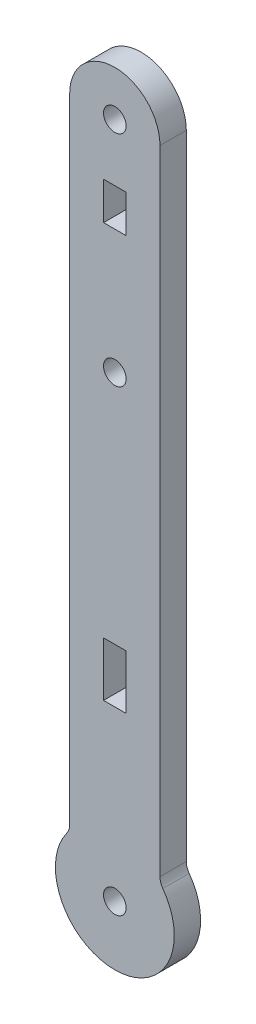
ISO-10303-21;
HEADER;
FILE_DESCRIPTION(('STEP AP214'),'2;1');
FILE_NAME('part.step','',(''),(''),'','','');
FILE_SCHEMA(('AUTOMOTIVE_DESIGN { 1 0 10303 214 1 1 1 1 }'));
ENDSEC;
DATA;
#1=APPLICATION_CONTEXT('core data for automotive mechanical design processes');
#2=APPLICATION_PROTOCOL_DEFINITION('international standard','automotive_design',2000,#1);
#3=PRODUCT_CONTEXT('',#1,'mechanical');
#4=PRODUCT('Part','Part','',(#3));
#5=PRODUCT_RELATED_PRODUCT_CATEGORY('part','',(#4));
#6=PRODUCT_DEFINITION_FORMATION('','',#4);
#7=PRODUCT_DEFINITION_CONTEXT('part definition',#1,'design');
#8=PRODUCT_DEFINITION('design','',#6,#7);
#9=PRODUCT_DEFINITION_SHAPE('','',#8);
#10=(LENGTH_UNIT() NAMED_UNIT(*) SI_UNIT(.MILLI.,.METRE.));
#11=(NAMED_UNIT(*) PLANE_ANGLE_UNIT() SI_UNIT($,.RADIAN.));
#12=(NAMED_UNIT(*) SI_UNIT($,.STERADIAN.) SOLID_ANGLE_UNIT());
#13=UNCERTAINTY_MEASURE_WITH_UNIT(LENGTH_MEASURE(1.E-05),#10,'distance_accuracy_value','');
#14=(GEOMETRIC_REPRESENTATION_CONTEXT(3) GLOBAL_UNCERTAINTY_ASSIGNED_CONTEXT((#13)) GLOBAL_UNIT_ASSIGNED_CONTEXT((#10,
#11,#12)) REPRESENTATION_CONTEXT('',''));
#15=CARTESIAN_POINT('',(0.,0.,0.));
#16=DIRECTION('',(0.,0.,1.));
#17=DIRECTION('',(1.,0.,0.));
#18=AXIS2_PLACEMENT_3D('',#15,#16,#17);
#19=CARTESIAN_POINT('',(0.,90.,3.5));
#20=DIRECTION('',(0.,0.,-1.));
#21=DIRECTION('',(-1.,0.,0.));
#22=AXIS2_PLACEMENT_3D('',#19,#20,#21);
#23=PLANE('',#22);
#24=CARTESIAN_POINT('',(0.,90.,3.5));
#25=DIRECTION('',(0.,0.,1.));
#26=DIRECTION('',(1.,0.,0.));
#27=AXIS2_PLACEMENT_3D('',#24,#25,#26);
#28=CIRCLE('',#27,1.5);
#29=CARTESIAN_POINT('',(1.5,90.,3.5));
#30=VERTEX_POINT('',#29);
#31=EDGE_CURVE('E184',#30,#30,#28,.T.);
#32=ORIENTED_EDGE('',*,*,#31,.F.);
#33=EDGE_LOOP('',(#32));
#34=FACE_BOUND('',#33,.T.);
#35=DIRECTION('',(1.,0.,0.));
#36=VECTOR('',#35,1.);
#37=CARTESIAN_POINT('',(-1.50000000000456,22.3769852360445,3.5));
#38=LINE('',#37,#36);
#39=CARTESIAN_POINT('',(-1.50000000000456,22.3769852360445,3.5));
#40=VERTEX_POINT('',#39);
#41=CARTESIAN_POINT('',(1.49999999999544,22.3769852360445,3.5));
#42=VERTEX_POINT('',#41);
#43=EDGE_CURVE('E190',#40,#42,#38,.T.);
#44=ORIENTED_EDGE('',*,*,#43,.F.);
#45=DIRECTION('',(0.,-1.,0.));
#46=VECTOR('',#45,1.);
#47=CARTESIAN_POINT('',(-1.50000000000456,29.5769852360445,3.5));
#48=LINE('',#47,#46);
#49=CARTESIAN_POINT('',(-1.50000000000456,29.5769852360445,3.5));
#50=VERTEX_POINT('',#49);
#51=EDGE_CURVE('E198',#50,#40,#48,.T.);
#52=ORIENTED_EDGE('',*,*,#51,.F.);
#53=DIRECTION('',(-1.,0.,0.));
#54=VECTOR('',#53,1.);
#55=CARTESIAN_POINT('',(1.49999999999544,29.5769852360445,3.5));
#56=LINE('',#55,#54);
#57=CARTESIAN_POINT('',(1.49999999999544,29.5769852360445,3.5));
#58=VERTEX_POINT('',#57);
#59=EDGE_CURVE('E195',#58,#50,#56,.T.);
#60=ORIENTED_EDGE('',*,*,#59,.F.);
#61=DIRECTION('',(0.,1.,0.));
#62=VECTOR('',#61,1.);
#63=CARTESIAN_POINT('',(1.49999999999544,22.3769852360445,3.5));
#64=LINE('',#63,#62);
#65=EDGE_CURVE('E192',#42,#58,#64,.T.);
#66=ORIENTED_EDGE('',*,*,#65,.F.);
#67=EDGE_LOOP('',(#44,#52,#60,#66));
#68=FACE_BOUND('',#67,.T.);
#69=CARTESIAN_POINT('',(0.,90.,3.5));
#70=DIRECTION('',(0.,0.,1.));
#71=DIRECTION('',(-1.,0.,0.));
#72=AXIS2_PLACEMENT_3D('',#69,#70,#71);
#73=CIRCLE('',#72,6.);
#74=CARTESIAN_POINT('',(6.,90.,3.5));
#75=VERTEX_POINT('',#74);
#76=CARTESIAN_POINT('',(-6.,90.,3.5));
#77=VERTEX_POINT('',#76);
#78=EDGE_CURVE('E228',#75,#77,#73,.T.);
#79=ORIENTED_EDGE('',*,*,#78,.T.);
#80=DIRECTION('',(0.,-1.,0.));
#81=VECTOR('',#80,1.);
#82=CARTESIAN_POINT('',(-6.,90.,3.5));
#83=LINE('',#82,#81);
#84=CARTESIAN_POINT('',(-5.99999999999999,5.83180932472935,3.5));
#85=VERTEX_POINT('',#84);
#86=EDGE_CURVE('E231',#77,#85,#83,.T.);
#87=ORIENTED_EDGE('',*,*,#86,.T.);
#88=CARTESIAN_POINT('',(-7.99999999999999,5.83180932472935,3.5));
#89=DIRECTION('',(0.,0.,-1.));
#90=DIRECTION('',(-1.,0.,0.));
#91=AXIS2_PLACEMENT_3D('',#88,#89,#90);
#92=CIRCLE('',#91,2.);
#93=CARTESIAN_POINT('',(-6.38383838383837,4.65366602680423,3.5));
#94=VERTEX_POINT('',#93);
#95=EDGE_CURVE('E265',#85,#94,#92,.T.);
#96=ORIENTED_EDGE('',*,*,#95,.T.);
#97=CARTESIAN_POINT('',(0.,0.,3.5));
#98=DIRECTION('',(0.,0.,1.));
#99=DIRECTION('',(1.,0.,0.));
#100=AXIS2_PLACEMENT_3D('',#97,#98,#99);
#101=CIRCLE('',#100,7.9);
#102=CARTESIAN_POINT('',(6.38383838383838,4.65366602680422,3.5));
#103=VERTEX_POINT('',#102);
#104=EDGE_CURVE('E235',#94,#103,#101,.T.);
#105=ORIENTED_EDGE('',*,*,#104,.T.);
#106=CARTESIAN_POINT('',(8.,5.83180932472933,3.5));
#107=DIRECTION('',(0.,0.,-1.));
#108=DIRECTION('',(-1.,0.,0.));
#109=AXIS2_PLACEMENT_3D('',#106,#107,#108);
#110=CIRCLE('',#109,2.);
#111=CARTESIAN_POINT('',(6.,5.83180932472933,3.5));
#112=VERTEX_POINT('',#111);
#113=EDGE_CURVE('E12',#103,#112,#110,.T.);
#114=ORIENTED_EDGE('',*,*,#113,.T.);
#115=DIRECTION('',(0.,1.,0.));
#116=VECTOR('',#115,1.);
#117=CARTESIAN_POINT('',(6.,90.,3.5));
#118=LINE('',#117,#116);
#119=EDGE_CURVE('E237',#112,#75,#118,.T.);
#120=ORIENTED_EDGE('',*,*,#119,.T.);
#121=EDGE_LOOP('',(#79,#87,#96,#105,#114,#120));
#122=FACE_BOUND('',#121,.T.);
#123=CARTESIAN_POINT('',(0.,0.,3.5));
#124=DIRECTION('',(0.,0.,1.));
#125=DIRECTION('',(1.,0.,0.));
#126=AXIS2_PLACEMENT_3D('',#123,#124,#125);
#127=CIRCLE('',#126,1.5);
#128=CARTESIAN_POINT('',(1.5,0.,3.5));
#129=VERTEX_POINT('',#128);
#130=EDGE_CURVE('E221',#129,#129,#127,.T.);
#131=ORIENTED_EDGE('',*,*,#130,.F.);
#132=EDGE_LOOP('',(#131));
#133=FACE_BOUND('',#132,.T.);
#134=DIRECTION('',(1.,0.,0.));
#135=VECTOR('',#134,1.);
#136=CARTESIAN_POINT('',(-1.50000000000457,77.3769852360445,3.5));
#137=LINE('',#136,#135);
#138=CARTESIAN_POINT('',(-1.50000000000457,77.3769852360445,3.5));
#139=VERTEX_POINT('',#138);
#140=CARTESIAN_POINT('',(1.49999999999543,77.3769852360445,3.5));
#141=VERTEX_POINT('',#140);
#142=EDGE_CURVE('E140',#139,#141,#137,.T.);
#143=ORIENTED_EDGE('',*,*,#142,.F.);
#144=DIRECTION('',(0.,-1.,0.));
#145=VECTOR('',#144,1.);
#146=CARTESIAN_POINT('',(-1.50000000000457,82.3769852360445,3.5));
#147=LINE('',#146,#145);
#148=CARTESIAN_POINT('',(-1.50000000000457,82.3769852360445,3.5));
#149=VERTEX_POINT('',#148);
#150=EDGE_CURVE('E166',#149,#139,#147,.T.);
#151=ORIENTED_EDGE('',*,*,#150,.F.);
#152=DIRECTION('',(-1.,0.,0.));
#153=VECTOR('',#152,1.);
#154=CARTESIAN_POINT('',(1.49999999999543,82.3769852360445,3.5));
#155=LINE('',#154,#153);
#156=CARTESIAN_POINT('',(1.49999999999543,82.3769852360445,3.5));
#157=VERTEX_POINT('',#156);
#158=EDGE_CURVE('E164',#157,#149,#155,.T.);
#159=ORIENTED_EDGE('',*,*,#158,.F.);
#160=DIRECTION('',(0.,1.,0.));
#161=VECTOR('',#160,1.);
#162=CARTESIAN_POINT('',(1.49999999999543,77.3769852360445,3.5));
#163=LINE('',#162,#161);
#164=EDGE_CURVE('E150',#141,#157,#163,.T.);
#165=ORIENTED_EDGE('',*,*,#164,.F.);
#166=EDGE_LOOP('',(#143,#151,#159,#165));
#167=FACE_BOUND('',#166,.T.);
#168=CARTESIAN_POINT('',(-4.56665955050894E-12,60.8769852360445,3.5));
#169=DIRECTION('',(0.,0.,1.));
#170=DIRECTION('',(1.,0.,0.));
#171=AXIS2_PLACEMENT_3D('',#168,#169,#170);
#172=CIRCLE('',#171,1.5);
#173=CARTESIAN_POINT('',(1.49999999999543,60.8769852360445,3.5));
#174=VERTEX_POINT('',#173);
#175=EDGE_CURVE('E173',#174,#174,#172,.T.);
#176=ORIENTED_EDGE('',*,*,#175,.F.);
#177=EDGE_LOOP('',(#176));
#178=FACE_BOUND('',#177,.T.);
#179=ADVANCED_FACE('F39',(#34,#68,#122,#133,#167,#178),#23,.F.);
#180=CARTESIAN_POINT('',(0.,90.,0.));
#181=DIRECTION('',(0.,0.,-1.));
#182=DIRECTION('',(-1.,0.,0.));
#183=AXIS2_PLACEMENT_3D('',#180,#181,#182);
#184=PLANE('',#183);
#185=DIRECTION('',(0.,-1.,0.));
#186=VECTOR('',#185,1.);
#187=CARTESIAN_POINT('',(-1.50000000000457,82.3769852360445,0.));
#188=LINE('',#187,#186);
#189=CARTESIAN_POINT('',(-1.50000000000457,82.3769852360445,0.));
#190=VERTEX_POINT('',#189);
#191=CARTESIAN_POINT('',(-1.50000000000457,77.3769852360445,0.));
#192=VERTEX_POINT('',#191);
#193=EDGE_CURVE('E151',#190,#192,#188,.T.);
#194=ORIENTED_EDGE('',*,*,#193,.T.);
#195=DIRECTION('',(1.,0.,0.));
#196=VECTOR('',#195,1.);
#197=CARTESIAN_POINT('',(-1.50000000000457,77.3769852360445,0.));
#198=LINE('',#197,#196);
#199=CARTESIAN_POINT('',(1.49999999999543,77.3769852360445,0.));
#200=VERTEX_POINT('',#199);
#201=EDGE_CURVE('E171',#192,#200,#198,.T.);
#202=ORIENTED_EDGE('',*,*,#201,.T.);
#203=DIRECTION('',(0.,1.,0.));
#204=VECTOR('',#203,1.);
#205=CARTESIAN_POINT('',(1.49999999999543,77.3769852360445,0.));
#206=LINE('',#205,#204);
#207=CARTESIAN_POINT('',(1.49999999999543,82.3769852360445,0.));
#208=VERTEX_POINT('',#207);
#209=EDGE_CURVE('E157',#200,#208,#206,.T.);
#210=ORIENTED_EDGE('',*,*,#209,.T.);
#211=DIRECTION('',(-1.,0.,0.));
#212=VECTOR('',#211,1.);
#213=CARTESIAN_POINT('',(1.49999999999543,82.3769852360445,0.));
#214=LINE('',#213,#212);
#215=EDGE_CURVE('E174',#208,#190,#214,.T.);
#216=ORIENTED_EDGE('',*,*,#215,.T.);
#217=EDGE_LOOP('',(#194,#202,#210,#216));
#218=FACE_BOUND('',#217,.T.);
#219=CARTESIAN_POINT('',(0.,90.,0.));
#220=DIRECTION('',(0.,0.,1.));
#221=DIRECTION('',(1.,0.,0.));
#222=AXIS2_PLACEMENT_3D('',#219,#220,#221);
#223=CIRCLE('',#222,1.5);
#224=CARTESIAN_POINT('',(1.5,90.,0.));
#225=VERTEX_POINT('',#224);
#226=EDGE_CURVE('E158',#225,#225,#223,.T.);
#227=ORIENTED_EDGE('',*,*,#226,.T.);
#228=EDGE_LOOP('',(#227));
#229=FACE_BOUND('',#228,.T.);
#230=CARTESIAN_POINT('',(0.,90.,0.));
#231=DIRECTION('',(0.,0.,1.));
#232=DIRECTION('',(-1.,0.,0.));
#233=AXIS2_PLACEMENT_3D('',#230,#231,#232);
#234=CIRCLE('',#233,6.);
#235=CARTESIAN_POINT('',(6.,90.,0.));
#236=VERTEX_POINT('',#235);
#237=CARTESIAN_POINT('',(-6.,90.,0.));
#238=VERTEX_POINT('',#237);
#239=EDGE_CURVE('E225',#236,#238,#234,.T.);
#240=ORIENTED_EDGE('',*,*,#239,.F.);
#241=DIRECTION('',(0.,1.,0.));
#242=VECTOR('',#241,1.);
#243=CARTESIAN_POINT('',(6.,90.,0.));
#244=LINE('',#243,#242);
#245=CARTESIAN_POINT('',(6.,5.83180932472933,0.));
#246=VERTEX_POINT('',#245);
#247=EDGE_CURVE('E232',#246,#236,#244,.T.);
#248=ORIENTED_EDGE('',*,*,#247,.F.);
#249=CARTESIAN_POINT('',(8.,5.83180932472933,0.));
#250=DIRECTION('',(0.,0.,-1.));
#251=DIRECTION('',(-1.,0.,0.));
#252=AXIS2_PLACEMENT_3D('',#249,#250,#251);
#253=CIRCLE('',#252,2.);
#254=CARTESIAN_POINT('',(6.38383838383838,4.65366602680422,0.));
#255=VERTEX_POINT('',#254);
#256=EDGE_CURVE('E47',#246,#255,#253,.F.);
#257=ORIENTED_EDGE('',*,*,#256,.T.);
#258=CARTESIAN_POINT('',(0.,0.,0.));
#259=DIRECTION('',(0.,0.,1.));
#260=DIRECTION('',(1.,0.,0.));
#261=AXIS2_PLACEMENT_3D('',#258,#259,#260);
#262=CIRCLE('',#261,7.9);
#263=CARTESIAN_POINT('',(-6.38383838383837,4.65366602680423,0.));
#264=VERTEX_POINT('',#263);
#265=EDGE_CURVE('E245',#264,#255,#262,.T.);
#266=ORIENTED_EDGE('',*,*,#265,.F.);
#267=CARTESIAN_POINT('',(-7.99999999999999,5.83180932472935,0.));
#268=DIRECTION('',(0.,0.,-1.));
#269=DIRECTION('',(-1.,0.,0.));
#270=AXIS2_PLACEMENT_3D('',#267,#268,#269);
#271=CIRCLE('',#270,2.);
#272=CARTESIAN_POINT('',(-5.99999999999999,5.83180932472935,0.));
#273=VERTEX_POINT('',#272);
#274=EDGE_CURVE('E263',#264,#273,#271,.F.);
#275=ORIENTED_EDGE('',*,*,#274,.T.);
#276=DIRECTION('',(0.,-1.,0.));
#277=VECTOR('',#276,1.);
#278=CARTESIAN_POINT('',(-6.,90.,0.));
#279=LINE('',#278,#277);
#280=EDGE_CURVE('E242',#238,#273,#279,.T.);
#281=ORIENTED_EDGE('',*,*,#280,.F.);
#282=EDGE_LOOP('',(#240,#248,#257,#266,#275,#281));
#283=FACE_BOUND('',#282,.T.);
#284=CARTESIAN_POINT('',(0.,0.,0.));
#285=DIRECTION('',(0.,0.,1.));
#286=DIRECTION('',(1.,0.,0.));
#287=AXIS2_PLACEMENT_3D('',#284,#285,#286);
#288=CIRCLE('',#287,1.5);
#289=CARTESIAN_POINT('',(1.5,0.,0.));
#290=VERTEX_POINT('',#289);
#291=EDGE_CURVE('E220',#290,#290,#288,.T.);
#292=ORIENTED_EDGE('',*,*,#291,.T.);
#293=EDGE_LOOP('',(#292));
#294=FACE_BOUND('',#293,.T.);
#295=DIRECTION('',(0.,-1.,0.));
#296=VECTOR('',#295,1.);
#297=CARTESIAN_POINT('',(-1.50000000000456,29.5769852360445,0.));
#298=LINE('',#297,#296);
#299=CARTESIAN_POINT('',(-1.50000000000456,29.5769852360445,0.));
#300=VERTEX_POINT('',#299);
#301=CARTESIAN_POINT('',(-1.50000000000456,22.3769852360445,0.));
#302=VERTEX_POINT('',#301);
#303=EDGE_CURVE('E193',#300,#302,#298,.T.);
#304=ORIENTED_EDGE('',*,*,#303,.T.);
#305=DIRECTION('',(1.,0.,0.));
#306=VECTOR('',#305,1.);
#307=CARTESIAN_POINT('',(-1.50000000000456,22.3769852360445,0.));
#308=LINE('',#307,#306);
#309=CARTESIAN_POINT('',(1.49999999999544,22.3769852360445,0.));
#310=VERTEX_POINT('',#309);
#311=EDGE_CURVE('E187',#302,#310,#308,.T.);
#312=ORIENTED_EDGE('',*,*,#311,.T.);
#313=DIRECTION('',(0.,1.,0.));
#314=VECTOR('',#313,1.);
#315=CARTESIAN_POINT('',(1.49999999999544,22.3769852360445,0.));
#316=LINE('',#315,#314);
#317=CARTESIAN_POINT('',(1.49999999999544,29.5769852360445,0.));
#318=VERTEX_POINT('',#317);
#319=EDGE_CURVE('E203',#310,#318,#316,.T.);
#320=ORIENTED_EDGE('',*,*,#319,.T.);
#321=DIRECTION('',(-1.,0.,0.));
#322=VECTOR('',#321,1.);
#323=CARTESIAN_POINT('',(1.49999999999544,29.5769852360445,0.));
#324=LINE('',#323,#322);
#325=EDGE_CURVE('E206',#318,#300,#324,.T.);
#326=ORIENTED_EDGE('',*,*,#325,.T.);
#327=EDGE_LOOP('',(#304,#312,#320,#326));
#328=FACE_BOUND('',#327,.T.);
#329=CARTESIAN_POINT('',(-4.56665955050894E-12,60.8769852360445,0.));
#330=DIRECTION('',(0.,0.,1.));
#331=DIRECTION('',(1.,0.,0.));
#332=AXIS2_PLACEMENT_3D('',#329,#330,#331);
#333=CIRCLE('',#332,1.5);
#334=CARTESIAN_POINT('',(1.49999999999543,60.8769852360445,0.));
#335=VERTEX_POINT('',#334);
#336=EDGE_CURVE('E480',#335,#335,#333,.T.);
#337=ORIENTED_EDGE('',*,*,#336,.T.);
#338=EDGE_LOOP('',(#337));
#339=FACE_BOUND('',#338,.T.);
#340=ADVANCED_FACE('F270',(#218,#229,#283,#294,#328,#339),#184,.T.);
#341=CARTESIAN_POINT('',(0.,90.,3.5));
#342=DIRECTION('',(0.,0.,-1.));
#343=DIRECTION('',(-1.,0.,0.));
#344=AXIS2_PLACEMENT_3D('',#341,#342,#343);
#345=CYLINDRICAL_SURFACE('',#344,6.);
#346=ORIENTED_EDGE('',*,*,#239,.T.);
#347=DIRECTION('',(0.,0.,-1.));
#348=VECTOR('',#347,1.);
#349=CARTESIAN_POINT('',(-6.,90.,3.5));
#350=LINE('',#349,#348);
#351=EDGE_CURVE('E251',#77,#238,#350,.T.);
#352=ORIENTED_EDGE('',*,*,#351,.F.);
#353=ORIENTED_EDGE('',*,*,#78,.F.);
#354=DIRECTION('',(0.,0.,-1.));
#355=VECTOR('',#354,1.);
#356=CARTESIAN_POINT('',(6.,90.,3.5));
#357=LINE('',#356,#355);
#358=EDGE_CURVE('E239',#75,#236,#357,.T.);
#359=ORIENTED_EDGE('',*,*,#358,.T.);
#360=EDGE_LOOP('',(#346,#352,#353,#359));
#361=FACE_BOUND('',#360,.T.);
#362=ADVANCED_FACE('F284',(#361),#345,.T.);
#363=CARTESIAN_POINT('',(-6.,90.,3.5));
#364=DIRECTION('',(1.,0.,0.));
#365=DIRECTION('',(0.,1.,0.));
#366=AXIS2_PLACEMENT_3D('',#363,#364,#365);
#367=PLANE('',#366);
#368=ORIENTED_EDGE('',*,*,#280,.T.);
#369=DIRECTION('',(0.,0.,1.));
#370=VECTOR('',#369,1.);
#371=CARTESIAN_POINT('',(-5.99999999999999,5.83180932472935,3.5));
#372=LINE('',#371,#370);
#373=EDGE_CURVE('E259',#273,#85,#372,.T.);
#374=ORIENTED_EDGE('',*,*,#373,.T.);
#375=ORIENTED_EDGE('',*,*,#86,.F.);
#376=ORIENTED_EDGE('',*,*,#351,.T.);
#377=EDGE_LOOP('',(#368,#374,#375,#376));
#378=FACE_BOUND('',#377,.T.);
#379=ADVANCED_FACE('F286',(#378),#367,.F.);
#380=CARTESIAN_POINT('',(0.,0.,3.5));
#381=DIRECTION('',(0.,0.,-1.));
#382=DIRECTION('',(-1.,0.,0.));
#383=AXIS2_PLACEMENT_3D('',#380,#381,#382);
#384=CYLINDRICAL_SURFACE('',#383,7.9);
#385=ORIENTED_EDGE('',*,*,#104,.F.);
#386=DIRECTION('',(0.,0.,-1.));
#387=VECTOR('',#386,1.);
#388=CARTESIAN_POINT('',(-6.38383838383837,4.65366602680423,3.5));
#389=LINE('',#388,#387);
#390=EDGE_CURVE('E256',#94,#264,#389,.T.);
#391=ORIENTED_EDGE('',*,*,#390,.T.);
#392=ORIENTED_EDGE('',*,*,#265,.T.);
#393=DIRECTION('',(0.,0.,-1.));
#394=VECTOR('',#393,1.);
#395=CARTESIAN_POINT('',(6.38383838383838,4.65366602680422,3.5));
#396=LINE('',#395,#394);
#397=EDGE_CURVE('E254',#255,#103,#396,.F.);
#398=ORIENTED_EDGE('',*,*,#397,.T.);
#399=EDGE_LOOP('',(#385,#391,#392,#398));
#400=FACE_BOUND('',#399,.T.);
#401=ADVANCED_FACE('F274',(#400),#384,.T.);
#402=CARTESIAN_POINT('',(6.,90.,3.5));
#403=DIRECTION('',(-1.,0.,0.));
#404=DIRECTION('',(0.,0.,1.));
#405=AXIS2_PLACEMENT_3D('',#402,#403,#404);
#406=PLANE('',#405);
#407=ORIENTED_EDGE('',*,*,#119,.F.);
#408=DIRECTION('',(0.,0.,1.));
#409=VECTOR('',#408,1.);
#410=CARTESIAN_POINT('',(6.,5.83180932472933,0.));
#411=LINE('',#410,#409);
#412=EDGE_CURVE('E261',#112,#246,#411,.F.);
#413=ORIENTED_EDGE('',*,*,#412,.T.);
#414=ORIENTED_EDGE('',*,*,#247,.T.);
#415=ORIENTED_EDGE('',*,*,#358,.F.);
#416=EDGE_LOOP('',(#407,#413,#414,#415));
#417=FACE_BOUND('',#416,.T.);
#418=ADVANCED_FACE('F277',(#417),#406,.F.);
#419=CARTESIAN_POINT('',(0.,0.,3.5));
#420=DIRECTION('',(0.,0.,-1.));
#421=DIRECTION('',(-1.,0.,0.));
#422=AXIS2_PLACEMENT_3D('',#419,#420,#421);
#423=CYLINDRICAL_SURFACE('',#422,1.5);
#424=ORIENTED_EDGE('',*,*,#130,.T.);
#425=EDGE_LOOP('',(#424));
#426=FACE_BOUND('',#425,.T.);
#427=ORIENTED_EDGE('',*,*,#291,.F.);
#428=EDGE_LOOP('',(#427));
#429=FACE_BOUND('',#428,.T.);
#430=ADVANCED_FACE('F311',(#426,#429),#423,.F.);
#431=CARTESIAN_POINT('',(-1.50000000000456,22.3769852360445,3.5));
#432=DIRECTION('',(0.,1.,0.));
#433=DIRECTION('',(0.,0.,1.));
#434=AXIS2_PLACEMENT_3D('',#431,#432,#433);
#435=PLANE('',#434);
#436=ORIENTED_EDGE('',*,*,#311,.F.);
#437=DIRECTION('',(0.,0.,-1.));
#438=VECTOR('',#437,1.);
#439=CARTESIAN_POINT('',(-1.50000000000456,22.3769852360445,3.5));
#440=LINE('',#439,#438);
#441=EDGE_CURVE('E200',#40,#302,#440,.T.);
#442=ORIENTED_EDGE('',*,*,#441,.F.);
#443=ORIENTED_EDGE('',*,*,#43,.T.);
#444=DIRECTION('',(0.,0.,-1.));
#445=VECTOR('',#444,1.);
#446=CARTESIAN_POINT('',(1.49999999999544,22.3769852360445,3.5));
#447=LINE('',#446,#445);
#448=EDGE_CURVE('E217',#42,#310,#447,.T.);
#449=ORIENTED_EDGE('',*,*,#448,.T.);
#450=EDGE_LOOP('',(#436,#442,#443,#449));
#451=FACE_BOUND('',#450,.T.);
#452=ADVANCED_FACE('F342',(#451),#435,.T.);
#453=CARTESIAN_POINT('',(1.49999999999544,22.3769852360445,3.5));
#454=DIRECTION('',(-1.,0.,0.));
#455=DIRECTION('',(0.,-1.,0.));
#456=AXIS2_PLACEMENT_3D('',#453,#454,#455);
#457=PLANE('',#456);
#458=ORIENTED_EDGE('',*,*,#319,.F.);
#459=ORIENTED_EDGE('',*,*,#448,.F.);
#460=ORIENTED_EDGE('',*,*,#65,.T.);
#461=DIRECTION('',(0.,0.,-1.));
#462=VECTOR('',#461,1.);
#463=CARTESIAN_POINT('',(1.49999999999544,29.5769852360445,3.5));
#464=LINE('',#463,#462);
#465=EDGE_CURVE('E215',#58,#318,#464,.T.);
#466=ORIENTED_EDGE('',*,*,#465,.T.);
#467=EDGE_LOOP('',(#458,#459,#460,#466));
#468=FACE_BOUND('',#467,.T.);
#469=ADVANCED_FACE('F349',(#468),#457,.T.);
#470=CARTESIAN_POINT('',(1.49999999999544,29.5769852360445,3.5));
#471=DIRECTION('',(0.,-1.,0.));
#472=DIRECTION('',(0.,0.,-1.));
#473=AXIS2_PLACEMENT_3D('',#470,#471,#472);
#474=PLANE('',#473);
#475=ORIENTED_EDGE('',*,*,#325,.F.);
#476=ORIENTED_EDGE('',*,*,#465,.F.);
#477=ORIENTED_EDGE('',*,*,#59,.T.);
#478=DIRECTION('',(0.,0.,-1.));
#479=VECTOR('',#478,1.);
#480=CARTESIAN_POINT('',(-1.50000000000456,29.5769852360445,3.5));
#481=LINE('',#480,#479);
#482=EDGE_CURVE('E213',#50,#300,#481,.T.);
#483=ORIENTED_EDGE('',*,*,#482,.T.);
#484=EDGE_LOOP('',(#475,#476,#477,#483));
#485=FACE_BOUND('',#484,.T.);
#486=ADVANCED_FACE('F356',(#485),#474,.T.);
#487=CARTESIAN_POINT('',(-1.50000000000456,29.5769852360445,3.5));
#488=DIRECTION('',(1.,0.,0.));
#489=DIRECTION('',(0.,1.,0.));
#490=AXIS2_PLACEMENT_3D('',#487,#488,#489);
#491=PLANE('',#490);
#492=ORIENTED_EDGE('',*,*,#303,.F.);
#493=ORIENTED_EDGE('',*,*,#482,.F.);
#494=ORIENTED_EDGE('',*,*,#51,.T.);
#495=ORIENTED_EDGE('',*,*,#441,.T.);
#496=EDGE_LOOP('',(#492,#493,#494,#495));
#497=FACE_BOUND('',#496,.T.);
#498=ADVANCED_FACE('F364',(#497),#491,.T.);
#499=CARTESIAN_POINT('',(0.,90.,3.5));
#500=DIRECTION('',(0.,0.,-1.));
#501=DIRECTION('',(-1.,0.,0.));
#502=AXIS2_PLACEMENT_3D('',#499,#500,#501);
#503=CYLINDRICAL_SURFACE('',#502,1.5);
#504=ORIENTED_EDGE('',*,*,#31,.T.);
#505=EDGE_LOOP('',(#504));
#506=FACE_BOUND('',#505,.T.);
#507=ORIENTED_EDGE('',*,*,#226,.F.);
#508=EDGE_LOOP('',(#507));
#509=FACE_BOUND('',#508,.T.);
#510=ADVANCED_FACE('F372',(#506,#509),#503,.F.);
#511=CARTESIAN_POINT('',(-1.50000000000457,77.3769852360445,3.5));
#512=DIRECTION('',(0.,1.,0.));
#513=DIRECTION('',(0.,0.,1.));
#514=AXIS2_PLACEMENT_3D('',#511,#512,#513);
#515=PLANE('',#514);
#516=ORIENTED_EDGE('',*,*,#201,.F.);
#517=DIRECTION('',(0.,0.,-1.));
#518=VECTOR('',#517,1.);
#519=CARTESIAN_POINT('',(-1.50000000000457,77.3769852360445,3.5));
#520=LINE('',#519,#518);
#521=EDGE_CURVE('E146',#139,#192,#520,.T.);
#522=ORIENTED_EDGE('',*,*,#521,.F.);
#523=ORIENTED_EDGE('',*,*,#142,.T.);
#524=DIRECTION('',(0.,0.,-1.));
#525=VECTOR('',#524,1.);
#526=CARTESIAN_POINT('',(1.49999999999543,77.3769852360445,3.5));
#527=LINE('',#526,#525);
#528=EDGE_CURVE('E143',#141,#200,#527,.T.);
#529=ORIENTED_EDGE('',*,*,#528,.T.);
#530=EDGE_LOOP('',(#516,#522,#523,#529));
#531=FACE_BOUND('',#530,.T.);
#532=ADVANCED_FACE('F142',(#531),#515,.T.);
#533=CARTESIAN_POINT('',(1.49999999999543,77.3769852360445,3.5));
#534=DIRECTION('',(-1.,0.,0.));
#535=DIRECTION('',(0.,-1.,0.));
#536=AXIS2_PLACEMENT_3D('',#533,#534,#535);
#537=PLANE('',#536);
#538=ORIENTED_EDGE('',*,*,#209,.F.);
#539=ORIENTED_EDGE('',*,*,#528,.F.);
#540=ORIENTED_EDGE('',*,*,#164,.T.);
#541=DIRECTION('',(0.,0.,-1.));
#542=VECTOR('',#541,1.);
#543=CARTESIAN_POINT('',(1.49999999999543,82.3769852360445,3.5));
#544=LINE('',#543,#542);
#545=EDGE_CURVE('E159',#157,#208,#544,.T.);
#546=ORIENTED_EDGE('',*,*,#545,.T.);
#547=EDGE_LOOP('',(#538,#539,#540,#546));
#548=FACE_BOUND('',#547,.T.);
#549=ADVANCED_FACE('F154',(#548),#537,.T.);
#550=CARTESIAN_POINT('',(1.49999999999543,82.3769852360445,3.5));
#551=DIRECTION('',(0.,-1.,0.));
#552=DIRECTION('',(0.,0.,-1.));
#553=AXIS2_PLACEMENT_3D('',#550,#551,#552);
#554=PLANE('',#553);
#555=ORIENTED_EDGE('',*,*,#215,.F.);
#556=ORIENTED_EDGE('',*,*,#545,.F.);
#557=ORIENTED_EDGE('',*,*,#158,.T.);
#558=DIRECTION('',(0.,0.,-1.));
#559=VECTOR('',#558,1.);
#560=CARTESIAN_POINT('',(-1.50000000000457,82.3769852360445,3.5));
#561=LINE('',#560,#559);
#562=EDGE_CURVE('E181',#149,#190,#561,.T.);
#563=ORIENTED_EDGE('',*,*,#562,.T.);
#564=EDGE_LOOP('',(#555,#556,#557,#563));
#565=FACE_BOUND('',#564,.T.);
#566=ADVANCED_FACE('F393',(#565),#554,.T.);
#567=CARTESIAN_POINT('',(-1.50000000000457,82.3769852360445,3.5));
#568=DIRECTION('',(1.,0.,0.));
#569=DIRECTION('',(0.,1.,0.));
#570=AXIS2_PLACEMENT_3D('',#567,#568,#569);
#571=PLANE('',#570);
#572=ORIENTED_EDGE('',*,*,#193,.F.);
#573=ORIENTED_EDGE('',*,*,#562,.F.);
#574=ORIENTED_EDGE('',*,*,#150,.T.);
#575=ORIENTED_EDGE('',*,*,#521,.T.);
#576=EDGE_LOOP('',(#572,#573,#574,#575));
#577=FACE_BOUND('',#576,.T.);
#578=ADVANCED_FACE('F296',(#577),#571,.T.);
#579=CARTESIAN_POINT('',(-4.56665955050894E-12,60.8769852360445,3.5));
#580=DIRECTION('',(0.,0.,-1.));
#581=DIRECTION('',(-1.,0.,0.));
#582=AXIS2_PLACEMENT_3D('',#579,#580,#581);
#583=CYLINDRICAL_SURFACE('',#582,1.5);
#584=ORIENTED_EDGE('',*,*,#175,.T.);
#585=EDGE_LOOP('',(#584));
#586=FACE_BOUND('',#585,.T.);
#587=ORIENTED_EDGE('',*,*,#336,.F.);
#588=EDGE_LOOP('',(#587));
#589=FACE_BOUND('',#588,.T.);
#590=ADVANCED_FACE('F291',(#586,#589),#583,.F.);
#591=CARTESIAN_POINT('',(-7.99999999999999,5.83180932472935,3.5));
#592=DIRECTION('',(0.,0.,-1.));
#593=DIRECTION('',(-1.,0.,0.));
#594=AXIS2_PLACEMENT_3D('',#591,#592,#593);
#595=CYLINDRICAL_SURFACE('',#594,2.);
#596=ORIENTED_EDGE('',*,*,#95,.F.);
#597=ORIENTED_EDGE('',*,*,#373,.F.);
#598=ORIENTED_EDGE('',*,*,#274,.F.);
#599=ORIENTED_EDGE('',*,*,#390,.F.);
#600=EDGE_LOOP('',(#596,#597,#598,#599));
#601=FACE_BOUND('',#600,.T.);
#602=ADVANCED_FACE('F289',(#601),#595,.F.);
#603=CARTESIAN_POINT('',(8.,5.83180932472933,3.5));
#604=DIRECTION('',(0.,0.,-1.));
#605=DIRECTION('',(-1.,0.,0.));
#606=AXIS2_PLACEMENT_3D('',#603,#604,#605);
#607=CYLINDRICAL_SURFACE('',#606,2.);
#608=ORIENTED_EDGE('',*,*,#113,.F.);
#609=ORIENTED_EDGE('',*,*,#397,.F.);
#610=ORIENTED_EDGE('',*,*,#256,.F.);
#611=ORIENTED_EDGE('',*,*,#412,.F.);
#612=EDGE_LOOP('',(#608,#609,#610,#611));
#613=FACE_BOUND('',#612,.T.);
#614=ADVANCED_FACE('F41',(#613),#607,.F.);
#615=CLOSED_SHELL('',(#179,#340,#362,#379,#401,#418,#430,#452,#469,#486,#498,#510,#532,#549,
#566,#578,#590,#602,#614));
#616=MANIFOLD_SOLID_BREP('B2',#615);
#617=ADVANCED_BREP_SHAPE_REPRESENTATION('',(#18,#616),#14);
#618=SHAPE_DEFINITION_REPRESENTATION(#9,#617);
ENDSEC;
END-ISO-10303-21;
